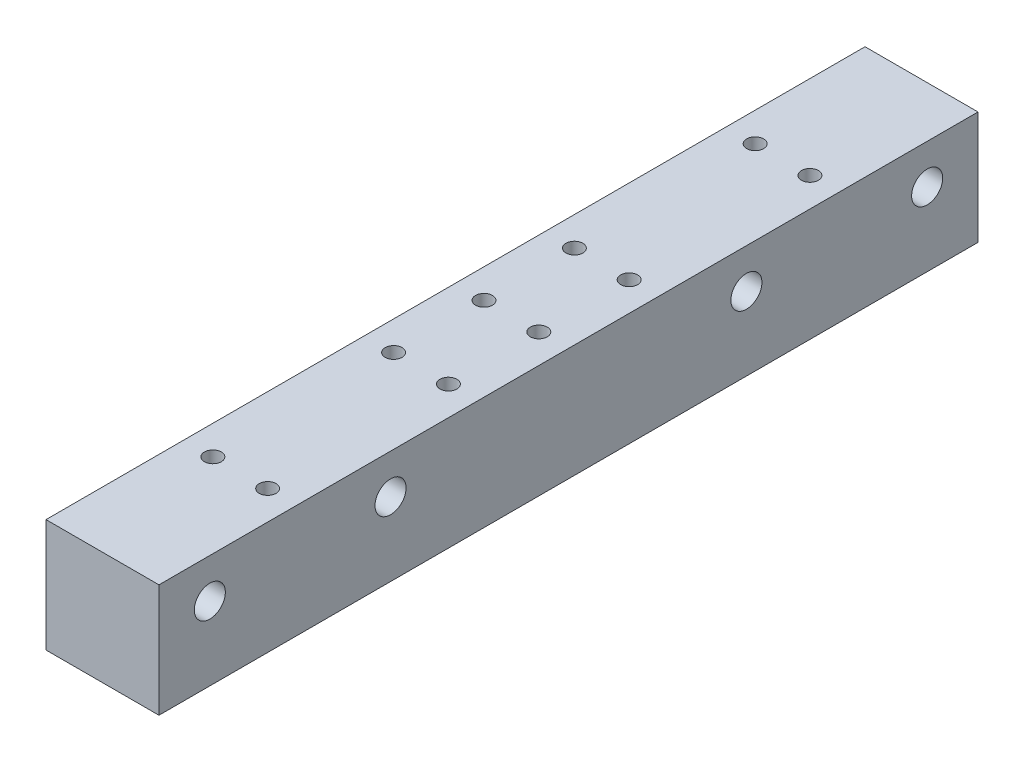
ISO-10303-21;
HEADER;
FILE_DESCRIPTION(('STEP AP214'),'2;1');
FILE_NAME('part.step','',(''),(''),'','','');
FILE_SCHEMA(('AUTOMOTIVE_DESIGN { 1 0 10303 214 1 1 1 1 }'));
ENDSEC;
DATA;
#1=APPLICATION_CONTEXT('core data for automotive mechanical design processes');
#2=APPLICATION_PROTOCOL_DEFINITION('international standard','automotive_design',2000,#1);
#3=PRODUCT_CONTEXT('',#1,'mechanical');
#4=PRODUCT('Part','Part','',(#3));
#5=PRODUCT_RELATED_PRODUCT_CATEGORY('part','',(#4));
#6=PRODUCT_DEFINITION_FORMATION('','',#4);
#7=PRODUCT_DEFINITION_CONTEXT('part definition',#1,'design');
#8=PRODUCT_DEFINITION('design','',#6,#7);
#9=PRODUCT_DEFINITION_SHAPE('','',#8);
#10=(LENGTH_UNIT() NAMED_UNIT(*) SI_UNIT(.MILLI.,.METRE.));
#11=(NAMED_UNIT(*) PLANE_ANGLE_UNIT() SI_UNIT($,.RADIAN.));
#12=(NAMED_UNIT(*) SI_UNIT($,.STERADIAN.) SOLID_ANGLE_UNIT());
#13=UNCERTAINTY_MEASURE_WITH_UNIT(LENGTH_MEASURE(1.E-05),#10,'distance_accuracy_value','');
#14=(GEOMETRIC_REPRESENTATION_CONTEXT(3) GLOBAL_UNCERTAINTY_ASSIGNED_CONTEXT((#13)) GLOBAL_UNIT_ASSIGNED_CONTEXT((#10,
#11,#12)) REPRESENTATION_CONTEXT('',''));
#15=CARTESIAN_POINT('',(0.,0.,0.));
#16=DIRECTION('',(0.,0.,1.));
#17=DIRECTION('',(1.,0.,0.));
#18=AXIS2_PLACEMENT_3D('',#15,#16,#17);
#19=CARTESIAN_POINT('',(10.,-10.,145.));
#20=DIRECTION('',(-1.,0.,0.));
#21=DIRECTION('',(0.,0.,1.));
#22=AXIS2_PLACEMENT_3D('',#19,#20,#21);
#23=PLANE('',#22);
#24=CARTESIAN_POINT('',(10.,3.,136.));
#25=DIRECTION('',(1.,0.,0.));
#26=DIRECTION('',(0.,0.,-1.));
#27=AXIS2_PLACEMENT_3D('',#24,#25,#26);
#28=CIRCLE('',#27,2.75000000000001);
#29=CARTESIAN_POINT('',(10.,3.,133.25));
#30=VERTEX_POINT('',#29);
#31=EDGE_CURVE('E129',#30,#30,#28,.T.);
#32=ORIENTED_EDGE('',*,*,#31,.F.);
#33=EDGE_LOOP('',(#32));
#34=FACE_BOUND('',#33,.T.);
#35=CARTESIAN_POINT('',(10.,3.,41.));
#36=DIRECTION('',(1.,0.,0.));
#37=DIRECTION('',(0.,0.,1.));
#38=AXIS2_PLACEMENT_3D('',#35,#36,#37);
#39=CIRCLE('',#38,2.75000000000001);
#40=CARTESIAN_POINT('',(10.,3.,38.25));
#41=VERTEX_POINT('',#40);
#42=EDGE_CURVE('E125',#41,#41,#39,.T.);
#43=ORIENTED_EDGE('',*,*,#42,.F.);
#44=EDGE_LOOP('',(#43));
#45=FACE_BOUND('',#44,.T.);
#46=CARTESIAN_POINT('',(10.,3.,9.00000000000001));
#47=DIRECTION('',(1.,0.,0.));
#48=DIRECTION('',(0.,0.,1.));
#49=AXIS2_PLACEMENT_3D('',#46,#47,#48);
#50=CIRCLE('',#49,2.75000000000001);
#51=CARTESIAN_POINT('',(10.,3.,6.25));
#52=VERTEX_POINT('',#51);
#53=EDGE_CURVE('E118',#52,#52,#50,.T.);
#54=ORIENTED_EDGE('',*,*,#53,.F.);
#55=EDGE_LOOP('',(#54));
#56=FACE_BOUND('',#55,.T.);
#57=CARTESIAN_POINT('',(10.,3.,104.));
#58=DIRECTION('',(1.,0.,0.));
#59=DIRECTION('',(0.,0.,-1.));
#60=AXIS2_PLACEMENT_3D('',#57,#58,#59);
#61=CIRCLE('',#60,2.75000000000001);
#62=CARTESIAN_POINT('',(10.,3.,101.25));
#63=VERTEX_POINT('',#62);
#64=EDGE_CURVE('E126',#63,#63,#61,.T.);
#65=ORIENTED_EDGE('',*,*,#64,.F.);
#66=EDGE_LOOP('',(#65));
#67=FACE_BOUND('',#66,.T.);
#68=DIRECTION('',(0.,1.,0.));
#69=VECTOR('',#68,1.);
#70=CARTESIAN_POINT('',(10.,-10.,0.));
#71=LINE('',#70,#69);
#72=CARTESIAN_POINT('',(10.,-10.,0.));
#73=VERTEX_POINT('',#72);
#74=CARTESIAN_POINT('',(10.,10.,0.));
#75=VERTEX_POINT('',#74);
#76=EDGE_CURVE('E104',#73,#75,#71,.T.);
#77=ORIENTED_EDGE('',*,*,#76,.T.);
#78=DIRECTION('',(0.,0.,-1.));
#79=VECTOR('',#78,1.);
#80=CARTESIAN_POINT('',(10.,10.,145.));
#81=LINE('',#80,#79);
#82=CARTESIAN_POINT('',(10.,10.,145.));
#83=VERTEX_POINT('',#82);
#84=EDGE_CURVE('E11',#83,#75,#81,.T.);
#85=ORIENTED_EDGE('',*,*,#84,.F.);
#86=DIRECTION('',(0.,1.,0.));
#87=VECTOR('',#86,1.);
#88=CARTESIAN_POINT('',(10.,-10.,145.));
#89=LINE('',#88,#87);
#90=CARTESIAN_POINT('',(10.,-10.,145.));
#91=VERTEX_POINT('',#90);
#92=EDGE_CURVE('E92',#91,#83,#89,.T.);
#93=ORIENTED_EDGE('',*,*,#92,.F.);
#94=DIRECTION('',(0.,0.,-1.));
#95=VECTOR('',#94,1.);
#96=CARTESIAN_POINT('',(10.,-10.,145.));
#97=LINE('',#96,#95);
#98=EDGE_CURVE('E100',#91,#73,#97,.T.);
#99=ORIENTED_EDGE('',*,*,#98,.T.);
#100=EDGE_LOOP('',(#77,#85,#93,#99));
#101=FACE_BOUND('',#100,.T.);
#102=ADVANCED_FACE('F41',(#34,#45,#56,#67,#101),#23,.F.);
#103=CARTESIAN_POINT('',(-10.,10.,145.));
#104=DIRECTION('',(0.,-1.,0.));
#105=DIRECTION('',(0.,0.,-1.));
#106=AXIS2_PLACEMENT_3D('',#103,#104,#105);
#107=PLANE('',#106);
#108=CARTESIAN_POINT('',(4.85000000000753,10.,24.6069730418757));
#109=DIRECTION('',(0.,1.,0.));
#110=DIRECTION('',(0.,0.,-1.));
#111=AXIS2_PLACEMENT_3D('',#108,#109,#110);
#112=CIRCLE('',#111,1.5);
#113=CARTESIAN_POINT('',(4.85000000000753,10.,23.1069730418757));
#114=VERTEX_POINT('',#113);
#115=EDGE_CURVE('E148',#114,#114,#112,.T.);
#116=ORIENTED_EDGE('',*,*,#115,.F.);
#117=EDGE_LOOP('',(#116));
#118=FACE_BOUND('',#117,.T.);
#119=CARTESIAN_POINT('',(4.85000000000753,10.,56.6069730418757));
#120=DIRECTION('',(0.,1.,0.));
#121=DIRECTION('',(0.,0.,-1.));
#122=AXIS2_PLACEMENT_3D('',#119,#120,#121);
#123=CIRCLE('',#122,1.5);
#124=CARTESIAN_POINT('',(4.85000000000753,10.,55.1069730418757));
#125=VERTEX_POINT('',#124);
#126=EDGE_CURVE('E155',#125,#125,#123,.T.);
#127=ORIENTED_EDGE('',*,*,#126,.F.);
#128=EDGE_LOOP('',(#127));
#129=FACE_BOUND('',#128,.T.);
#130=CARTESIAN_POINT('',(4.85000000000753,10.,72.6069730418757));
#131=DIRECTION('',(0.,1.,0.));
#132=DIRECTION('',(0.,0.,-1.));
#133=AXIS2_PLACEMENT_3D('',#130,#131,#132);
#134=CIRCLE('',#133,1.5);
#135=CARTESIAN_POINT('',(4.85000000000753,10.,71.1069730418757));
#136=VERTEX_POINT('',#135);
#137=EDGE_CURVE('E161',#136,#136,#134,.T.);
#138=ORIENTED_EDGE('',*,*,#137,.F.);
#139=EDGE_LOOP('',(#138));
#140=FACE_BOUND('',#139,.T.);
#141=CARTESIAN_POINT('',(4.85000000000754,10.,88.6069730418757));
#142=DIRECTION('',(0.,1.,0.));
#143=DIRECTION('',(0.,0.,-1.));
#144=AXIS2_PLACEMENT_3D('',#141,#142,#143);
#145=CIRCLE('',#144,1.5);
#146=CARTESIAN_POINT('',(4.85000000000754,10.,87.1069730418757));
#147=VERTEX_POINT('',#146);
#148=EDGE_CURVE('E167',#147,#147,#145,.T.);
#149=ORIENTED_EDGE('',*,*,#148,.F.);
#150=EDGE_LOOP('',(#149));
#151=FACE_BOUND('',#150,.T.);
#152=CARTESIAN_POINT('',(4.85000000000753,10.,120.606973041876));
#153=DIRECTION('',(0.,1.,0.));
#154=DIRECTION('',(0.,0.,-1.));
#155=AXIS2_PLACEMENT_3D('',#152,#153,#154);
#156=CIRCLE('',#155,1.5);
#157=CARTESIAN_POINT('',(4.85000000000753,10.,119.106973041876));
#158=VERTEX_POINT('',#157);
#159=EDGE_CURVE('E173',#158,#158,#156,.T.);
#160=ORIENTED_EDGE('',*,*,#159,.F.);
#161=EDGE_LOOP('',(#160));
#162=FACE_BOUND('',#161,.T.);
#163=CARTESIAN_POINT('',(-4.8500000000075,10.,120.606973041876));
#164=DIRECTION('',(0.,1.,0.));
#165=DIRECTION('',(0.,0.,1.));
#166=AXIS2_PLACEMENT_3D('',#163,#164,#165);
#167=CIRCLE('',#166,1.5);
#168=CARTESIAN_POINT('',(-4.8500000000075,10.,122.106973041876));
#169=VERTEX_POINT('',#168);
#170=EDGE_CURVE('E179',#169,#169,#167,.T.);
#171=ORIENTED_EDGE('',*,*,#170,.F.);
#172=EDGE_LOOP('',(#171));
#173=FACE_BOUND('',#172,.T.);
#174=CARTESIAN_POINT('',(-4.85000000000752,10.,88.6069730418757));
#175=DIRECTION('',(0.,1.,0.));
#176=DIRECTION('',(0.,0.,1.));
#177=AXIS2_PLACEMENT_3D('',#174,#175,#176);
#178=CIRCLE('',#177,1.5);
#179=CARTESIAN_POINT('',(-4.85000000000752,10.,90.1069730418757));
#180=VERTEX_POINT('',#179);
#181=EDGE_CURVE('E185',#180,#180,#178,.T.);
#182=ORIENTED_EDGE('',*,*,#181,.F.);
#183=EDGE_LOOP('',(#182));
#184=FACE_BOUND('',#183,.T.);
#185=CARTESIAN_POINT('',(-4.85000000000752,10.,72.6069730418757));
#186=DIRECTION('',(0.,1.,0.));
#187=DIRECTION('',(0.,0.,1.));
#188=AXIS2_PLACEMENT_3D('',#185,#186,#187);
#189=CIRCLE('',#188,1.5);
#190=CARTESIAN_POINT('',(-4.85000000000752,10.,74.1069730418757));
#191=VERTEX_POINT('',#190);
#192=EDGE_CURVE('E191',#191,#191,#189,.T.);
#193=ORIENTED_EDGE('',*,*,#192,.F.);
#194=EDGE_LOOP('',(#193));
#195=FACE_BOUND('',#194,.T.);
#196=CARTESIAN_POINT('',(-4.85000000000752,10.,56.6069730418757));
#197=DIRECTION('',(0.,1.,0.));
#198=DIRECTION('',(0.,0.,1.));
#199=AXIS2_PLACEMENT_3D('',#196,#197,#198);
#200=CIRCLE('',#199,1.5);
#201=CARTESIAN_POINT('',(-4.85000000000752,10.,58.1069730418757));
#202=VERTEX_POINT('',#201);
#203=EDGE_CURVE('E147',#202,#202,#200,.T.);
#204=ORIENTED_EDGE('',*,*,#203,.F.);
#205=EDGE_LOOP('',(#204));
#206=FACE_BOUND('',#205,.T.);
#207=CARTESIAN_POINT('',(-4.85000000000753,10.,24.6069730418757));
#208=DIRECTION('',(0.,1.,0.));
#209=DIRECTION('',(0.,0.,1.));
#210=AXIS2_PLACEMENT_3D('',#207,#208,#209);
#211=CIRCLE('',#210,1.5);
#212=CARTESIAN_POINT('',(-4.85000000000753,10.,26.1069730418757));
#213=VERTEX_POINT('',#212);
#214=EDGE_CURVE('E144',#213,#213,#211,.T.);
#215=ORIENTED_EDGE('',*,*,#214,.F.);
#216=EDGE_LOOP('',(#215));
#217=FACE_BOUND('',#216,.T.);
#218=DIRECTION('',(-1.,0.,0.));
#219=VECTOR('',#218,1.);
#220=CARTESIAN_POINT('',(-10.,10.,0.));
#221=LINE('',#220,#219);
#222=CARTESIAN_POINT('',(-10.,10.,0.));
#223=VERTEX_POINT('',#222);
#224=EDGE_CURVE('E96',#75,#223,#221,.T.);
#225=ORIENTED_EDGE('',*,*,#224,.T.);
#226=DIRECTION('',(0.,0.,-1.));
#227=VECTOR('',#226,1.);
#228=CARTESIAN_POINT('',(-10.,10.,145.));
#229=LINE('',#228,#227);
#230=CARTESIAN_POINT('',(-10.,10.,145.));
#231=VERTEX_POINT('',#230);
#232=EDGE_CURVE('E49',#231,#223,#229,.T.);
#233=ORIENTED_EDGE('',*,*,#232,.F.);
#234=DIRECTION('',(-1.,0.,0.));
#235=VECTOR('',#234,1.);
#236=CARTESIAN_POINT('',(-10.,10.,145.));
#237=LINE('',#236,#235);
#238=EDGE_CURVE('E87',#83,#231,#237,.T.);
#239=ORIENTED_EDGE('',*,*,#238,.F.);
#240=ORIENTED_EDGE('',*,*,#84,.T.);
#241=EDGE_LOOP('',(#225,#233,#239,#240));
#242=FACE_BOUND('',#241,.T.);
#243=ADVANCED_FACE('F95',(#118,#129,#140,#151,#162,#173,#184,#195,#206,#217,#242),#107,.F.);
#244=CARTESIAN_POINT('',(-10.,-10.,145.));
#245=DIRECTION('',(1.,0.,0.));
#246=DIRECTION('',(0.,0.,-1.));
#247=AXIS2_PLACEMENT_3D('',#244,#245,#246);
#248=PLANE('',#247);
#249=CARTESIAN_POINT('',(-10.,3.,136.));
#250=DIRECTION('',(1.,0.,0.));
#251=DIRECTION('',(0.,0.,-1.));
#252=AXIS2_PLACEMENT_3D('',#249,#250,#251);
#253=CIRCLE('',#252,2.75000000000001);
#254=CARTESIAN_POINT('',(-10.,3.,133.25));
#255=VERTEX_POINT('',#254);
#256=EDGE_CURVE('E107',#255,#255,#253,.F.);
#257=ORIENTED_EDGE('',*,*,#256,.F.);
#258=EDGE_LOOP('',(#257));
#259=FACE_BOUND('',#258,.T.);
#260=CARTESIAN_POINT('',(-10.,3.,41.));
#261=DIRECTION('',(1.,0.,0.));
#262=DIRECTION('',(0.,0.,-1.));
#263=AXIS2_PLACEMENT_3D('',#260,#261,#262);
#264=CIRCLE('',#263,2.75000000000001);
#265=CARTESIAN_POINT('',(-10.,3.,38.25));
#266=VERTEX_POINT('',#265);
#267=EDGE_CURVE('E134',#266,#266,#264,.F.);
#268=ORIENTED_EDGE('',*,*,#267,.F.);
#269=EDGE_LOOP('',(#268));
#270=FACE_BOUND('',#269,.T.);
#271=CARTESIAN_POINT('',(-10.,3.,9.00000000000001));
#272=DIRECTION('',(1.,0.,0.));
#273=DIRECTION('',(0.,0.,-1.));
#274=AXIS2_PLACEMENT_3D('',#271,#272,#273);
#275=CIRCLE('',#274,2.75000000000001);
#276=CARTESIAN_POINT('',(-10.,3.,6.25));
#277=VERTEX_POINT('',#276);
#278=EDGE_CURVE('E122',#277,#277,#275,.F.);
#279=ORIENTED_EDGE('',*,*,#278,.F.);
#280=EDGE_LOOP('',(#279));
#281=FACE_BOUND('',#280,.T.);
#282=CARTESIAN_POINT('',(-10.,3.,104.));
#283=DIRECTION('',(1.,0.,0.));
#284=DIRECTION('',(0.,0.,-1.));
#285=AXIS2_PLACEMENT_3D('',#282,#283,#284);
#286=CIRCLE('',#285,2.75000000000001);
#287=CARTESIAN_POINT('',(-10.,3.,101.25));
#288=VERTEX_POINT('',#287);
#289=EDGE_CURVE('E121',#288,#288,#286,.F.);
#290=ORIENTED_EDGE('',*,*,#289,.F.);
#291=EDGE_LOOP('',(#290));
#292=FACE_BOUND('',#291,.T.);
#293=DIRECTION('',(0.,-1.,0.));
#294=VECTOR('',#293,1.);
#295=CARTESIAN_POINT('',(-10.,-10.,0.));
#296=LINE('',#295,#294);
#297=CARTESIAN_POINT('',(-10.,-10.,0.));
#298=VERTEX_POINT('',#297);
#299=EDGE_CURVE('E74',#223,#298,#296,.T.);
#300=ORIENTED_EDGE('',*,*,#299,.T.);
#301=DIRECTION('',(0.,0.,-1.));
#302=VECTOR('',#301,1.);
#303=CARTESIAN_POINT('',(-10.,-10.,145.));
#304=LINE('',#303,#302);
#305=CARTESIAN_POINT('',(-10.,-10.,145.));
#306=VERTEX_POINT('',#305);
#307=EDGE_CURVE('E97',#306,#298,#304,.T.);
#308=ORIENTED_EDGE('',*,*,#307,.F.);
#309=DIRECTION('',(0.,-1.,0.));
#310=VECTOR('',#309,1.);
#311=CARTESIAN_POINT('',(-10.,-10.,145.));
#312=LINE('',#311,#310);
#313=EDGE_CURVE('E90',#231,#306,#312,.T.);
#314=ORIENTED_EDGE('',*,*,#313,.F.);
#315=ORIENTED_EDGE('',*,*,#232,.T.);
#316=EDGE_LOOP('',(#300,#308,#314,#315));
#317=FACE_BOUND('',#316,.T.);
#318=ADVANCED_FACE('F98',(#259,#270,#281,#292,#317),#248,.F.);
#319=CARTESIAN_POINT('',(-10.,-10.,145.));
#320=DIRECTION('',(0.,1.,0.));
#321=DIRECTION('',(0.,0.,1.));
#322=AXIS2_PLACEMENT_3D('',#319,#320,#321);
#323=PLANE('',#322);
#324=CARTESIAN_POINT('',(4.85000000000753,-10.,24.6069730418757));
#325=DIRECTION('',(0.,1.,0.));
#326=DIRECTION('',(0.,0.,1.));
#327=AXIS2_PLACEMENT_3D('',#324,#325,#326);
#328=CIRCLE('',#327,1.5);
#329=CARTESIAN_POINT('',(4.85000000000753,-10.,26.1069730418757));
#330=VERTEX_POINT('',#329);
#331=EDGE_CURVE('E152',#330,#330,#328,.F.);
#332=ORIENTED_EDGE('',*,*,#331,.F.);
#333=EDGE_LOOP('',(#332));
#334=FACE_BOUND('',#333,.T.);
#335=CARTESIAN_POINT('',(4.85000000000753,-10.,56.6069730418757));
#336=DIRECTION('',(0.,1.,0.));
#337=DIRECTION('',(0.,0.,1.));
#338=AXIS2_PLACEMENT_3D('',#335,#336,#337);
#339=CIRCLE('',#338,1.5);
#340=CARTESIAN_POINT('',(4.85000000000753,-10.,58.1069730418757));
#341=VERTEX_POINT('',#340);
#342=EDGE_CURVE('E151',#341,#341,#339,.F.);
#343=ORIENTED_EDGE('',*,*,#342,.F.);
#344=EDGE_LOOP('',(#343));
#345=FACE_BOUND('',#344,.T.);
#346=CARTESIAN_POINT('',(4.85000000000753,-10.,72.6069730418757));
#347=DIRECTION('',(0.,1.,0.));
#348=DIRECTION('',(0.,0.,1.));
#349=AXIS2_PLACEMENT_3D('',#346,#347,#348);
#350=CIRCLE('',#349,1.5);
#351=CARTESIAN_POINT('',(4.85000000000753,-10.,74.1069730418757));
#352=VERTEX_POINT('',#351);
#353=EDGE_CURVE('E158',#352,#352,#350,.F.);
#354=ORIENTED_EDGE('',*,*,#353,.F.);
#355=EDGE_LOOP('',(#354));
#356=FACE_BOUND('',#355,.T.);
#357=CARTESIAN_POINT('',(4.85000000000754,-10.,88.6069730418757));
#358=DIRECTION('',(0.,1.,0.));
#359=DIRECTION('',(0.,0.,1.));
#360=AXIS2_PLACEMENT_3D('',#357,#358,#359);
#361=CIRCLE('',#360,1.5);
#362=CARTESIAN_POINT('',(4.85000000000754,-10.,90.1069730418757));
#363=VERTEX_POINT('',#362);
#364=EDGE_CURVE('E164',#363,#363,#361,.F.);
#365=ORIENTED_EDGE('',*,*,#364,.F.);
#366=EDGE_LOOP('',(#365));
#367=FACE_BOUND('',#366,.T.);
#368=CARTESIAN_POINT('',(4.85000000000753,-10.,120.606973041876));
#369=DIRECTION('',(0.,1.,0.));
#370=DIRECTION('',(0.,0.,1.));
#371=AXIS2_PLACEMENT_3D('',#368,#369,#370);
#372=CIRCLE('',#371,1.5);
#373=CARTESIAN_POINT('',(4.85000000000753,-10.,122.106973041876));
#374=VERTEX_POINT('',#373);
#375=EDGE_CURVE('E170',#374,#374,#372,.F.);
#376=ORIENTED_EDGE('',*,*,#375,.F.);
#377=EDGE_LOOP('',(#376));
#378=FACE_BOUND('',#377,.T.);
#379=CARTESIAN_POINT('',(-4.8500000000075,-10.,120.606973041876));
#380=DIRECTION('',(0.,1.,0.));
#381=DIRECTION('',(0.,0.,1.));
#382=AXIS2_PLACEMENT_3D('',#379,#380,#381);
#383=CIRCLE('',#382,1.5);
#384=CARTESIAN_POINT('',(-4.8500000000075,-10.,122.106973041876));
#385=VERTEX_POINT('',#384);
#386=EDGE_CURVE('E176',#385,#385,#383,.F.);
#387=ORIENTED_EDGE('',*,*,#386,.F.);
#388=EDGE_LOOP('',(#387));
#389=FACE_BOUND('',#388,.T.);
#390=CARTESIAN_POINT('',(-4.85000000000752,-10.,88.6069730418757));
#391=DIRECTION('',(0.,1.,0.));
#392=DIRECTION('',(0.,0.,1.));
#393=AXIS2_PLACEMENT_3D('',#390,#391,#392);
#394=CIRCLE('',#393,1.5);
#395=CARTESIAN_POINT('',(-4.85000000000752,-10.,90.1069730418757));
#396=VERTEX_POINT('',#395);
#397=EDGE_CURVE('E182',#396,#396,#394,.F.);
#398=ORIENTED_EDGE('',*,*,#397,.F.);
#399=EDGE_LOOP('',(#398));
#400=FACE_BOUND('',#399,.T.);
#401=CARTESIAN_POINT('',(-4.85000000000752,-10.,72.6069730418757));
#402=DIRECTION('',(0.,1.,0.));
#403=DIRECTION('',(0.,0.,1.));
#404=AXIS2_PLACEMENT_3D('',#401,#402,#403);
#405=CIRCLE('',#404,1.5);
#406=CARTESIAN_POINT('',(-4.85000000000752,-10.,74.1069730418757));
#407=VERTEX_POINT('',#406);
#408=EDGE_CURVE('E188',#407,#407,#405,.F.);
#409=ORIENTED_EDGE('',*,*,#408,.F.);
#410=EDGE_LOOP('',(#409));
#411=FACE_BOUND('',#410,.T.);
#412=CARTESIAN_POINT('',(-4.85000000000752,-10.,56.6069730418757));
#413=DIRECTION('',(0.,1.,0.));
#414=DIRECTION('',(0.,0.,1.));
#415=AXIS2_PLACEMENT_3D('',#412,#413,#414);
#416=CIRCLE('',#415,1.5);
#417=CARTESIAN_POINT('',(-4.85000000000752,-10.,58.1069730418757));
#418=VERTEX_POINT('',#417);
#419=EDGE_CURVE('E194',#418,#418,#416,.F.);
#420=ORIENTED_EDGE('',*,*,#419,.F.);
#421=EDGE_LOOP('',(#420));
#422=FACE_BOUND('',#421,.T.);
#423=CARTESIAN_POINT('',(-4.85000000000753,-10.,24.6069730418757));
#424=DIRECTION('',(0.,1.,0.));
#425=DIRECTION('',(0.,0.,1.));
#426=AXIS2_PLACEMENT_3D('',#423,#424,#425);
#427=CIRCLE('',#426,1.5);
#428=CARTESIAN_POINT('',(-4.85000000000753,-10.,26.1069730418757));
#429=VERTEX_POINT('',#428);
#430=EDGE_CURVE('E137',#429,#429,#427,.F.);
#431=ORIENTED_EDGE('',*,*,#430,.F.);
#432=EDGE_LOOP('',(#431));
#433=FACE_BOUND('',#432,.T.);
#434=DIRECTION('',(1.,0.,0.));
#435=VECTOR('',#434,1.);
#436=CARTESIAN_POINT('',(-10.,-10.,0.));
#437=LINE('',#436,#435);
#438=EDGE_CURVE('E80',#298,#73,#437,.T.);
#439=ORIENTED_EDGE('',*,*,#438,.T.);
#440=ORIENTED_EDGE('',*,*,#98,.F.);
#441=DIRECTION('',(1.,0.,0.));
#442=VECTOR('',#441,1.);
#443=CARTESIAN_POINT('',(-10.,-10.,145.));
#444=LINE('',#443,#442);
#445=EDGE_CURVE('E57',#306,#91,#444,.T.);
#446=ORIENTED_EDGE('',*,*,#445,.F.);
#447=ORIENTED_EDGE('',*,*,#307,.T.);
#448=EDGE_LOOP('',(#439,#440,#446,#447));
#449=FACE_BOUND('',#448,.T.);
#450=ADVANCED_FACE('F112',(#334,#345,#356,#367,#378,#389,#400,#411,#422,#433,#449),#323,.F.);
#451=CARTESIAN_POINT('',(0.,0.,145.));
#452=DIRECTION('',(0.,0.,-1.));
#453=DIRECTION('',(-1.,0.,0.));
#454=AXIS2_PLACEMENT_3D('',#451,#452,#453);
#455=PLANE('',#454);
#456=ORIENTED_EDGE('',*,*,#92,.T.);
#457=ORIENTED_EDGE('',*,*,#238,.T.);
#458=ORIENTED_EDGE('',*,*,#313,.T.);
#459=ORIENTED_EDGE('',*,*,#445,.T.);
#460=EDGE_LOOP('',(#456,#457,#458,#459));
#461=FACE_BOUND('',#460,.T.);
#462=ADVANCED_FACE('F88',(#461),#455,.F.);
#463=CARTESIAN_POINT('',(0.,0.,0.));
#464=DIRECTION('',(0.,0.,-1.));
#465=DIRECTION('',(-1.,0.,0.));
#466=AXIS2_PLACEMENT_3D('',#463,#464,#465);
#467=PLANE('',#466);
#468=ORIENTED_EDGE('',*,*,#76,.F.);
#469=ORIENTED_EDGE('',*,*,#438,.F.);
#470=ORIENTED_EDGE('',*,*,#299,.F.);
#471=ORIENTED_EDGE('',*,*,#224,.F.);
#472=EDGE_LOOP('',(#468,#469,#470,#471));
#473=FACE_BOUND('',#472,.T.);
#474=ADVANCED_FACE('F115',(#473),#467,.T.);
#475=CARTESIAN_POINT('',(-17.7781745930521,3.,104.));
#476=DIRECTION('',(1.,0.,0.));
#477=DIRECTION('',(0.,0.,-1.));
#478=AXIS2_PLACEMENT_3D('',#475,#476,#477);
#479=CYLINDRICAL_SURFACE('',#478,2.75000000000001);
#480=CARTESIAN_POINT('',(-10.,3.,101.25));
#481=CARTESIAN_POINT('',(-9.79166666666667,3.,101.25));
#482=CARTESIAN_POINT('',(-9.58333333333333,3.,101.25));
#483=CARTESIAN_POINT('',(-9.16666666666667,3.,101.25));
#484=CARTESIAN_POINT('',(-8.95833333333333,3.,101.25));
#485=CARTESIAN_POINT('',(-8.54166666666667,3.,101.25));
#486=CARTESIAN_POINT('',(-8.33333333333333,3.,101.25));
#487=CARTESIAN_POINT('',(-7.91666666666667,3.,101.25));
#488=CARTESIAN_POINT('',(-7.70833333333333,3.,101.25));
#489=CARTESIAN_POINT('',(-7.29166666666667,3.,101.25));
#490=CARTESIAN_POINT('',(-7.08333333333333,3.,101.25));
#491=CARTESIAN_POINT('',(-6.66666666666667,3.,101.25));
#492=CARTESIAN_POINT('',(-6.45833333333333,3.,101.25));
#493=CARTESIAN_POINT('',(-6.04166666666667,3.,101.25));
#494=CARTESIAN_POINT('',(-5.83333333333333,3.,101.25));
#495=CARTESIAN_POINT('',(-5.41666666666667,3.,101.25));
#496=CARTESIAN_POINT('',(-5.20833333333333,3.,101.25));
#497=CARTESIAN_POINT('',(-4.79166666666667,3.,101.25));
#498=CARTESIAN_POINT('',(-4.58333333333333,3.,101.25));
#499=CARTESIAN_POINT('',(-4.16666666666667,3.,101.25));
#500=CARTESIAN_POINT('',(-3.95833333333333,3.,101.25));
#501=CARTESIAN_POINT('',(-3.54166666666667,3.,101.25));
#502=CARTESIAN_POINT('',(-3.33333333333333,3.,101.25));
#503=CARTESIAN_POINT('',(-2.91666666666667,3.,101.25));
#504=CARTESIAN_POINT('',(-2.70833333333333,3.,101.25));
#505=CARTESIAN_POINT('',(-2.29166666666667,3.,101.25));
#506=CARTESIAN_POINT('',(-2.08333333333333,3.,101.25));
#507=CARTESIAN_POINT('',(-1.66666666666667,3.,101.25));
#508=CARTESIAN_POINT('',(-1.45833333333333,3.,101.25));
#509=CARTESIAN_POINT('',(-1.04166666666667,3.,101.25));
#510=CARTESIAN_POINT('',(-0.833333333333334,3.,101.25));
#511=CARTESIAN_POINT('',(-0.416666666666667,3.,101.25));
#512=CARTESIAN_POINT('',(-0.208333333333333,3.,101.25));
#513=CARTESIAN_POINT('',(0.208333333333333,3.,101.25));
#514=CARTESIAN_POINT('',(0.416666666666667,3.,101.25));
#515=CARTESIAN_POINT('',(0.833333333333334,3.,101.25));
#516=CARTESIAN_POINT('',(1.04166666666667,3.,101.25));
#517=CARTESIAN_POINT('',(1.45833333333333,3.,101.25));
#518=CARTESIAN_POINT('',(1.66666666666667,3.,101.25));
#519=CARTESIAN_POINT('',(2.08333333333334,3.,101.25));
#520=CARTESIAN_POINT('',(2.29166666666667,3.,101.25));
#521=CARTESIAN_POINT('',(2.70833333333334,3.,101.25));
#522=CARTESIAN_POINT('',(2.91666666666667,3.,101.25));
#523=CARTESIAN_POINT('',(3.33333333333334,3.,101.25));
#524=CARTESIAN_POINT('',(3.54166666666667,3.,101.25));
#525=CARTESIAN_POINT('',(3.95833333333333,3.,101.25));
#526=CARTESIAN_POINT('',(4.16666666666667,3.,101.25));
#527=CARTESIAN_POINT('',(4.58333333333333,3.,101.25));
#528=CARTESIAN_POINT('',(4.79166666666667,3.,101.25));
#529=CARTESIAN_POINT('',(5.20833333333333,3.,101.25));
#530=CARTESIAN_POINT('',(5.41666666666667,3.,101.25));
#531=CARTESIAN_POINT('',(5.83333333333334,3.,101.25));
#532=CARTESIAN_POINT('',(6.04166666666667,3.,101.25));
#533=CARTESIAN_POINT('',(6.45833333333334,3.,101.25));
#534=CARTESIAN_POINT('',(6.66666666666667,3.,101.25));
#535=CARTESIAN_POINT('',(7.08333333333333,3.,101.25));
#536=CARTESIAN_POINT('',(7.29166666666667,3.,101.25));
#537=CARTESIAN_POINT('',(7.70833333333333,3.,101.25));
#538=CARTESIAN_POINT('',(7.91666666666667,3.,101.25));
#539=CARTESIAN_POINT('',(8.33333333333333,3.,101.25));
#540=CARTESIAN_POINT('',(8.54166666666667,3.,101.25));
#541=CARTESIAN_POINT('',(8.95833333333333,3.,101.25));
#542=CARTESIAN_POINT('',(9.16666666666667,3.,101.25));
#543=CARTESIAN_POINT('',(9.58333333333333,3.,101.25));
#544=CARTESIAN_POINT('',(9.79166666666667,3.,101.25));
#545=CARTESIAN_POINT('',(10.,3.,101.25));
#546=B_SPLINE_CURVE_WITH_KNOTS('',3,(#480,#481,#482,#483,#484,#485,#486,#487,#488,#489,#490,
#491,#492,#493,#494,#495,#496,#497,#498,#499,#500,#501,#502,#503,#504,#505,#506,#507,#508,#509,
#510,#511,#512,#513,#514,#515,#516,#517,#518,#519,#520,#521,#522,#523,#524,#525,#526,#527,#528,
#529,#530,#531,#532,#533,#534,#535,#536,#537,#538,#539,#540,#541,#542,#543,#544,#545),
.UNSPECIFIED.,.F.,.F.,(4,2,2,2,2,2,2,2,2,2,2,2,2,2,2,2,2,2,2,2,2,2,2,2,2,2,2,2,2,2,2,2,4),(0.,
0.624999999999999,1.25,1.875,2.5,3.125,3.75,4.375,5.,5.625,6.25,6.875,7.5,8.125,8.75,9.375,10.,
10.625,11.25,11.875,12.5,13.125,13.75,14.375,15.,15.625,16.25,16.875,17.5,18.125,18.75,19.375,
20.),.UNSPECIFIED.);
#547=EDGE_CURVE('BSEAM233',#288,#63,#546,.T.);
#548=ORIENTED_EDGE('',*,*,#289,.T.);
#549=ORIENTED_EDGE('',*,*,#64,.T.);
#550=ORIENTED_EDGE('',*,*,#547,.T.);
#551=ORIENTED_EDGE('',*,*,#547,.F.);
#552=EDGE_LOOP('',(#548,#550,#549,#551));
#553=FACE_BOUND('',#552,.T.);
#554=ADVANCED_FACE('F233',(#553),#479,.F.);
#555=CARTESIAN_POINT('',(-17.7781745930521,3.,9.00000000000001));
#556=DIRECTION('',(1.,0.,0.));
#557=DIRECTION('',(0.,0.,-1.));
#558=AXIS2_PLACEMENT_3D('',#555,#556,#557);
#559=CYLINDRICAL_SURFACE('',#558,2.75000000000001);
#560=CARTESIAN_POINT('',(-10.,3.,6.25));
#561=CARTESIAN_POINT('',(-9.79166666666667,3.,6.25));
#562=CARTESIAN_POINT('',(-9.58333333333333,3.,6.25));
#563=CARTESIAN_POINT('',(-9.16666666666667,3.,6.25));
#564=CARTESIAN_POINT('',(-8.95833333333333,3.,6.25));
#565=CARTESIAN_POINT('',(-8.54166666666667,3.,6.25));
#566=CARTESIAN_POINT('',(-8.33333333333333,3.,6.25));
#567=CARTESIAN_POINT('',(-7.91666666666667,3.,6.25));
#568=CARTESIAN_POINT('',(-7.70833333333333,3.,6.25));
#569=CARTESIAN_POINT('',(-7.29166666666667,3.,6.25));
#570=CARTESIAN_POINT('',(-7.08333333333333,3.,6.25));
#571=CARTESIAN_POINT('',(-6.66666666666667,3.,6.25));
#572=CARTESIAN_POINT('',(-6.45833333333333,3.,6.25));
#573=CARTESIAN_POINT('',(-6.04166666666667,3.,6.25));
#574=CARTESIAN_POINT('',(-5.83333333333333,3.,6.25));
#575=CARTESIAN_POINT('',(-5.41666666666667,3.,6.25));
#576=CARTESIAN_POINT('',(-5.20833333333333,3.,6.25));
#577=CARTESIAN_POINT('',(-4.79166666666667,3.,6.25));
#578=CARTESIAN_POINT('',(-4.58333333333333,3.,6.25));
#579=CARTESIAN_POINT('',(-4.16666666666667,3.,6.25));
#580=CARTESIAN_POINT('',(-3.95833333333333,3.,6.25));
#581=CARTESIAN_POINT('',(-3.54166666666667,3.,6.25));
#582=CARTESIAN_POINT('',(-3.33333333333333,3.,6.25));
#583=CARTESIAN_POINT('',(-2.91666666666667,3.,6.25));
#584=CARTESIAN_POINT('',(-2.70833333333333,3.,6.25));
#585=CARTESIAN_POINT('',(-2.29166666666667,3.,6.25));
#586=CARTESIAN_POINT('',(-2.08333333333333,3.,6.25));
#587=CARTESIAN_POINT('',(-1.66666666666667,3.,6.25));
#588=CARTESIAN_POINT('',(-1.45833333333333,3.,6.25));
#589=CARTESIAN_POINT('',(-1.04166666666667,3.,6.25));
#590=CARTESIAN_POINT('',(-0.833333333333334,3.,6.25));
#591=CARTESIAN_POINT('',(-0.416666666666667,3.,6.25));
#592=CARTESIAN_POINT('',(-0.208333333333333,3.,6.25));
#593=CARTESIAN_POINT('',(0.208333333333333,3.,6.25));
#594=CARTESIAN_POINT('',(0.416666666666667,3.,6.25));
#595=CARTESIAN_POINT('',(0.833333333333334,3.,6.25));
#596=CARTESIAN_POINT('',(1.04166666666667,3.,6.25));
#597=CARTESIAN_POINT('',(1.45833333333333,3.,6.25));
#598=CARTESIAN_POINT('',(1.66666666666667,3.,6.25));
#599=CARTESIAN_POINT('',(2.08333333333334,3.,6.25));
#600=CARTESIAN_POINT('',(2.29166666666667,3.,6.25));
#601=CARTESIAN_POINT('',(2.70833333333334,3.,6.25));
#602=CARTESIAN_POINT('',(2.91666666666667,3.,6.25));
#603=CARTESIAN_POINT('',(3.33333333333334,3.,6.25));
#604=CARTESIAN_POINT('',(3.54166666666667,3.,6.25));
#605=CARTESIAN_POINT('',(3.95833333333333,3.,6.25));
#606=CARTESIAN_POINT('',(4.16666666666667,3.,6.25));
#607=CARTESIAN_POINT('',(4.58333333333333,3.,6.25));
#608=CARTESIAN_POINT('',(4.79166666666667,3.,6.25));
#609=CARTESIAN_POINT('',(5.20833333333333,3.,6.25));
#610=CARTESIAN_POINT('',(5.41666666666667,3.,6.25));
#611=CARTESIAN_POINT('',(5.83333333333334,3.,6.25));
#612=CARTESIAN_POINT('',(6.04166666666667,3.,6.25));
#613=CARTESIAN_POINT('',(6.45833333333334,3.,6.25));
#614=CARTESIAN_POINT('',(6.66666666666667,3.,6.25));
#615=CARTESIAN_POINT('',(7.08333333333333,3.,6.25));
#616=CARTESIAN_POINT('',(7.29166666666667,3.,6.25));
#617=CARTESIAN_POINT('',(7.70833333333333,3.,6.25));
#618=CARTESIAN_POINT('',(7.91666666666667,3.,6.25));
#619=CARTESIAN_POINT('',(8.33333333333333,3.,6.25));
#620=CARTESIAN_POINT('',(8.54166666666667,3.,6.25));
#621=CARTESIAN_POINT('',(8.95833333333333,3.,6.25));
#622=CARTESIAN_POINT('',(9.16666666666667,3.,6.25));
#623=CARTESIAN_POINT('',(9.58333333333333,3.,6.25));
#624=CARTESIAN_POINT('',(9.79166666666667,3.,6.25));
#625=CARTESIAN_POINT('',(10.,3.,6.25));
#626=B_SPLINE_CURVE_WITH_KNOTS('',3,(#560,#561,#562,#563,#564,#565,#566,#567,#568,#569,#570,
#571,#572,#573,#574,#575,#576,#577,#578,#579,#580,#581,#582,#583,#584,#585,#586,#587,#588,#589,
#590,#591,#592,#593,#594,#595,#596,#597,#598,#599,#600,#601,#602,#603,#604,#605,#606,#607,#608,
#609,#610,#611,#612,#613,#614,#615,#616,#617,#618,#619,#620,#621,#622,#623,#624,#625),
.UNSPECIFIED.,.F.,.F.,(4,2,2,2,2,2,2,2,2,2,2,2,2,2,2,2,2,2,2,2,2,2,2,2,2,2,2,2,2,2,2,2,4),(0.,
0.624999999999999,1.25,1.875,2.5,3.125,3.75,4.375,5.,5.625,6.25,6.875,7.5,8.125,8.75,9.375,10.,
10.625,11.25,11.875,12.5,13.125,13.75,14.375,15.,15.625,16.25,16.875,17.5,18.125,18.75,19.375,
20.),.UNSPECIFIED.);
#627=EDGE_CURVE('BSEAM236',#277,#52,#626,.T.);
#628=ORIENTED_EDGE('',*,*,#278,.T.);
#629=ORIENTED_EDGE('',*,*,#53,.T.);
#630=ORIENTED_EDGE('',*,*,#627,.T.);
#631=ORIENTED_EDGE('',*,*,#627,.F.);
#632=EDGE_LOOP('',(#628,#630,#629,#631));
#633=FACE_BOUND('',#632,.T.);
#634=ADVANCED_FACE('F236',(#633),#559,.F.);
#635=CARTESIAN_POINT('',(-17.7781745930521,3.,41.));
#636=DIRECTION('',(1.,0.,0.));
#637=DIRECTION('',(0.,0.,-1.));
#638=AXIS2_PLACEMENT_3D('',#635,#636,#637);
#639=CYLINDRICAL_SURFACE('',#638,2.75000000000001);
#640=CARTESIAN_POINT('',(-10.,3.,38.25));
#641=CARTESIAN_POINT('',(-9.79166666666667,3.,38.25));
#642=CARTESIAN_POINT('',(-9.58333333333333,3.,38.25));
#643=CARTESIAN_POINT('',(-9.16666666666667,3.,38.25));
#644=CARTESIAN_POINT('',(-8.95833333333333,3.,38.25));
#645=CARTESIAN_POINT('',(-8.54166666666667,3.,38.25));
#646=CARTESIAN_POINT('',(-8.33333333333333,3.,38.25));
#647=CARTESIAN_POINT('',(-7.91666666666667,3.,38.25));
#648=CARTESIAN_POINT('',(-7.70833333333333,3.,38.25));
#649=CARTESIAN_POINT('',(-7.29166666666667,3.,38.25));
#650=CARTESIAN_POINT('',(-7.08333333333333,3.,38.25));
#651=CARTESIAN_POINT('',(-6.66666666666667,3.,38.25));
#652=CARTESIAN_POINT('',(-6.45833333333333,3.,38.25));
#653=CARTESIAN_POINT('',(-6.04166666666667,3.,38.25));
#654=CARTESIAN_POINT('',(-5.83333333333333,3.,38.25));
#655=CARTESIAN_POINT('',(-5.41666666666667,3.,38.25));
#656=CARTESIAN_POINT('',(-5.20833333333333,3.,38.25));
#657=CARTESIAN_POINT('',(-4.79166666666667,3.,38.25));
#658=CARTESIAN_POINT('',(-4.58333333333333,3.,38.25));
#659=CARTESIAN_POINT('',(-4.16666666666667,3.,38.25));
#660=CARTESIAN_POINT('',(-3.95833333333333,3.,38.25));
#661=CARTESIAN_POINT('',(-3.54166666666667,3.,38.25));
#662=CARTESIAN_POINT('',(-3.33333333333333,3.,38.25));
#663=CARTESIAN_POINT('',(-2.91666666666667,3.,38.25));
#664=CARTESIAN_POINT('',(-2.70833333333333,3.,38.25));
#665=CARTESIAN_POINT('',(-2.29166666666667,3.,38.25));
#666=CARTESIAN_POINT('',(-2.08333333333333,3.,38.25));
#667=CARTESIAN_POINT('',(-1.66666666666667,3.,38.25));
#668=CARTESIAN_POINT('',(-1.45833333333333,3.,38.25));
#669=CARTESIAN_POINT('',(-1.04166666666667,3.,38.25));
#670=CARTESIAN_POINT('',(-0.833333333333334,3.,38.25));
#671=CARTESIAN_POINT('',(-0.416666666666667,3.,38.25));
#672=CARTESIAN_POINT('',(-0.208333333333333,3.,38.25));
#673=CARTESIAN_POINT('',(0.208333333333333,3.,38.25));
#674=CARTESIAN_POINT('',(0.416666666666667,3.,38.25));
#675=CARTESIAN_POINT('',(0.833333333333334,3.,38.25));
#676=CARTESIAN_POINT('',(1.04166666666667,3.,38.25));
#677=CARTESIAN_POINT('',(1.45833333333333,3.,38.25));
#678=CARTESIAN_POINT('',(1.66666666666667,3.,38.25));
#679=CARTESIAN_POINT('',(2.08333333333334,3.,38.25));
#680=CARTESIAN_POINT('',(2.29166666666667,3.,38.25));
#681=CARTESIAN_POINT('',(2.70833333333334,3.,38.25));
#682=CARTESIAN_POINT('',(2.91666666666667,3.,38.25));
#683=CARTESIAN_POINT('',(3.33333333333334,3.,38.25));
#684=CARTESIAN_POINT('',(3.54166666666667,3.,38.25));
#685=CARTESIAN_POINT('',(3.95833333333333,3.,38.25));
#686=CARTESIAN_POINT('',(4.16666666666667,3.,38.25));
#687=CARTESIAN_POINT('',(4.58333333333333,3.,38.25));
#688=CARTESIAN_POINT('',(4.79166666666667,3.,38.25));
#689=CARTESIAN_POINT('',(5.20833333333333,3.,38.25));
#690=CARTESIAN_POINT('',(5.41666666666667,3.,38.25));
#691=CARTESIAN_POINT('',(5.83333333333334,3.,38.25));
#692=CARTESIAN_POINT('',(6.04166666666667,3.,38.25));
#693=CARTESIAN_POINT('',(6.45833333333334,3.,38.25));
#694=CARTESIAN_POINT('',(6.66666666666667,3.,38.25));
#695=CARTESIAN_POINT('',(7.08333333333333,3.,38.25));
#696=CARTESIAN_POINT('',(7.29166666666667,3.,38.25));
#697=CARTESIAN_POINT('',(7.70833333333333,3.,38.25));
#698=CARTESIAN_POINT('',(7.91666666666667,3.,38.25));
#699=CARTESIAN_POINT('',(8.33333333333333,3.,38.25));
#700=CARTESIAN_POINT('',(8.54166666666667,3.,38.25));
#701=CARTESIAN_POINT('',(8.95833333333333,3.,38.25));
#702=CARTESIAN_POINT('',(9.16666666666667,3.,38.25));
#703=CARTESIAN_POINT('',(9.58333333333333,3.,38.25));
#704=CARTESIAN_POINT('',(9.79166666666667,3.,38.25));
#705=CARTESIAN_POINT('',(10.,3.,38.25));
#706=B_SPLINE_CURVE_WITH_KNOTS('',3,(#640,#641,#642,#643,#644,#645,#646,#647,#648,#649,#650,
#651,#652,#653,#654,#655,#656,#657,#658,#659,#660,#661,#662,#663,#664,#665,#666,#667,#668,#669,
#670,#671,#672,#673,#674,#675,#676,#677,#678,#679,#680,#681,#682,#683,#684,#685,#686,#687,#688,
#689,#690,#691,#692,#693,#694,#695,#696,#697,#698,#699,#700,#701,#702,#703,#704,#705),
.UNSPECIFIED.,.F.,.F.,(4,2,2,2,2,2,2,2,2,2,2,2,2,2,2,2,2,2,2,2,2,2,2,2,2,2,2,2,2,2,2,2,4),(0.,
0.624999999999999,1.25,1.875,2.5,3.125,3.75,4.375,5.,5.625,6.25,6.875,7.5,8.125,8.75,9.375,10.,
10.625,11.25,11.875,12.5,13.125,13.75,14.375,15.,15.625,16.25,16.875,17.5,18.125,18.75,19.375,
20.),.UNSPECIFIED.);
#707=EDGE_CURVE('BSEAM239',#266,#41,#706,.T.);
#708=ORIENTED_EDGE('',*,*,#267,.T.);
#709=ORIENTED_EDGE('',*,*,#42,.T.);
#710=ORIENTED_EDGE('',*,*,#707,.T.);
#711=ORIENTED_EDGE('',*,*,#707,.F.);
#712=EDGE_LOOP('',(#708,#710,#709,#711));
#713=FACE_BOUND('',#712,.T.);
#714=ADVANCED_FACE('F239',(#713),#639,.F.);
#715=CARTESIAN_POINT('',(-17.7781745930521,3.,136.));
#716=DIRECTION('',(1.,0.,0.));
#717=DIRECTION('',(0.,0.,-1.));
#718=AXIS2_PLACEMENT_3D('',#715,#716,#717);
#719=CYLINDRICAL_SURFACE('',#718,2.75000000000001);
#720=CARTESIAN_POINT('',(-10.,3.,133.25));
#721=CARTESIAN_POINT('',(-9.79166666666667,3.,133.25));
#722=CARTESIAN_POINT('',(-9.58333333333333,3.,133.25));
#723=CARTESIAN_POINT('',(-9.16666666666667,3.,133.25));
#724=CARTESIAN_POINT('',(-8.95833333333333,3.,133.25));
#725=CARTESIAN_POINT('',(-8.54166666666667,3.,133.25));
#726=CARTESIAN_POINT('',(-8.33333333333333,3.,133.25));
#727=CARTESIAN_POINT('',(-7.91666666666667,3.,133.25));
#728=CARTESIAN_POINT('',(-7.70833333333333,3.,133.25));
#729=CARTESIAN_POINT('',(-7.29166666666667,3.,133.25));
#730=CARTESIAN_POINT('',(-7.08333333333333,3.,133.25));
#731=CARTESIAN_POINT('',(-6.66666666666667,3.,133.25));
#732=CARTESIAN_POINT('',(-6.45833333333333,3.,133.25));
#733=CARTESIAN_POINT('',(-6.04166666666667,3.,133.25));
#734=CARTESIAN_POINT('',(-5.83333333333333,3.,133.25));
#735=CARTESIAN_POINT('',(-5.41666666666667,3.,133.25));
#736=CARTESIAN_POINT('',(-5.20833333333333,3.,133.25));
#737=CARTESIAN_POINT('',(-4.79166666666667,3.,133.25));
#738=CARTESIAN_POINT('',(-4.58333333333333,3.,133.25));
#739=CARTESIAN_POINT('',(-4.16666666666667,3.,133.25));
#740=CARTESIAN_POINT('',(-3.95833333333333,3.,133.25));
#741=CARTESIAN_POINT('',(-3.54166666666667,3.,133.25));
#742=CARTESIAN_POINT('',(-3.33333333333333,3.,133.25));
#743=CARTESIAN_POINT('',(-2.91666666666667,3.,133.25));
#744=CARTESIAN_POINT('',(-2.70833333333333,3.,133.25));
#745=CARTESIAN_POINT('',(-2.29166666666667,3.,133.25));
#746=CARTESIAN_POINT('',(-2.08333333333333,3.,133.25));
#747=CARTESIAN_POINT('',(-1.66666666666667,3.,133.25));
#748=CARTESIAN_POINT('',(-1.45833333333333,3.,133.25));
#749=CARTESIAN_POINT('',(-1.04166666666667,3.,133.25));
#750=CARTESIAN_POINT('',(-0.833333333333334,3.,133.25));
#751=CARTESIAN_POINT('',(-0.416666666666667,3.,133.25));
#752=CARTESIAN_POINT('',(-0.208333333333333,3.,133.25));
#753=CARTESIAN_POINT('',(0.208333333333333,3.,133.25));
#754=CARTESIAN_POINT('',(0.416666666666667,3.,133.25));
#755=CARTESIAN_POINT('',(0.833333333333334,3.,133.25));
#756=CARTESIAN_POINT('',(1.04166666666667,3.,133.25));
#757=CARTESIAN_POINT('',(1.45833333333333,3.,133.25));
#758=CARTESIAN_POINT('',(1.66666666666667,3.,133.25));
#759=CARTESIAN_POINT('',(2.08333333333334,3.,133.25));
#760=CARTESIAN_POINT('',(2.29166666666667,3.,133.25));
#761=CARTESIAN_POINT('',(2.70833333333334,3.,133.25));
#762=CARTESIAN_POINT('',(2.91666666666667,3.,133.25));
#763=CARTESIAN_POINT('',(3.33333333333334,3.,133.25));
#764=CARTESIAN_POINT('',(3.54166666666667,3.,133.25));
#765=CARTESIAN_POINT('',(3.95833333333333,3.,133.25));
#766=CARTESIAN_POINT('',(4.16666666666667,3.,133.25));
#767=CARTESIAN_POINT('',(4.58333333333333,3.,133.25));
#768=CARTESIAN_POINT('',(4.79166666666667,3.,133.25));
#769=CARTESIAN_POINT('',(5.20833333333333,3.,133.25));
#770=CARTESIAN_POINT('',(5.41666666666667,3.,133.25));
#771=CARTESIAN_POINT('',(5.83333333333334,3.,133.25));
#772=CARTESIAN_POINT('',(6.04166666666667,3.,133.25));
#773=CARTESIAN_POINT('',(6.45833333333334,3.,133.25));
#774=CARTESIAN_POINT('',(6.66666666666667,3.,133.25));
#775=CARTESIAN_POINT('',(7.08333333333333,3.,133.25));
#776=CARTESIAN_POINT('',(7.29166666666667,3.,133.25));
#777=CARTESIAN_POINT('',(7.70833333333333,3.,133.25));
#778=CARTESIAN_POINT('',(7.91666666666667,3.,133.25));
#779=CARTESIAN_POINT('',(8.33333333333333,3.,133.25));
#780=CARTESIAN_POINT('',(8.54166666666667,3.,133.25));
#781=CARTESIAN_POINT('',(8.95833333333333,3.,133.25));
#782=CARTESIAN_POINT('',(9.16666666666667,3.,133.25));
#783=CARTESIAN_POINT('',(9.58333333333333,3.,133.25));
#784=CARTESIAN_POINT('',(9.79166666666667,3.,133.25));
#785=CARTESIAN_POINT('',(10.,3.,133.25));
#786=B_SPLINE_CURVE_WITH_KNOTS('',3,(#720,#721,#722,#723,#724,#725,#726,#727,#728,#729,#730,
#731,#732,#733,#734,#735,#736,#737,#738,#739,#740,#741,#742,#743,#744,#745,#746,#747,#748,#749,
#750,#751,#752,#753,#754,#755,#756,#757,#758,#759,#760,#761,#762,#763,#764,#765,#766,#767,#768,
#769,#770,#771,#772,#773,#774,#775,#776,#777,#778,#779,#780,#781,#782,#783,#784,#785),
.UNSPECIFIED.,.F.,.F.,(4,2,2,2,2,2,2,2,2,2,2,2,2,2,2,2,2,2,2,2,2,2,2,2,2,2,2,2,2,2,2,2,4),(0.,
0.624999999999999,1.25,1.875,2.5,3.125,3.75,4.375,5.,5.625,6.25,6.875,7.5,8.125,8.75,9.375,10.,
10.625,11.25,11.875,12.5,13.125,13.75,14.375,15.,15.625,16.25,16.875,17.5,18.125,18.75,19.375,
20.),.UNSPECIFIED.);
#787=EDGE_CURVE('BSEAM214',#255,#30,#786,.T.);
#788=ORIENTED_EDGE('',*,*,#256,.T.);
#789=ORIENTED_EDGE('',*,*,#31,.T.);
#790=ORIENTED_EDGE('',*,*,#787,.T.);
#791=ORIENTED_EDGE('',*,*,#787,.F.);
#792=EDGE_LOOP('',(#788,#790,#789,#791));
#793=FACE_BOUND('',#792,.T.);
#794=ADVANCED_FACE('F214',(#793),#719,.F.);
#795=CARTESIAN_POINT('',(-4.85000000000753,-14.2426406871193,24.6069730418757));
#796=DIRECTION('',(0.,1.,0.));
#797=DIRECTION('',(0.,0.,1.));
#798=AXIS2_PLACEMENT_3D('',#795,#796,#797);
#799=CYLINDRICAL_SURFACE('',#798,1.5);
#800=ORIENTED_EDGE('',*,*,#430,.T.);
#801=EDGE_LOOP('',(#800));
#802=FACE_BOUND('',#801,.T.);
#803=ORIENTED_EDGE('',*,*,#214,.T.);
#804=EDGE_LOOP('',(#803));
#805=FACE_BOUND('',#804,.T.);
#806=ADVANCED_FACE('F211',(#802,#805),#799,.F.);
#807=CARTESIAN_POINT('',(-4.85000000000752,-14.2426406871193,56.6069730418757));
#808=DIRECTION('',(0.,1.,0.));
#809=DIRECTION('',(0.,0.,1.));
#810=AXIS2_PLACEMENT_3D('',#807,#808,#809);
#811=CYLINDRICAL_SURFACE('',#810,1.5);
#812=ORIENTED_EDGE('',*,*,#419,.T.);
#813=EDGE_LOOP('',(#812));
#814=FACE_BOUND('',#813,.T.);
#815=ORIENTED_EDGE('',*,*,#203,.T.);
#816=EDGE_LOOP('',(#815));
#817=FACE_BOUND('',#816,.T.);
#818=ADVANCED_FACE('F202',(#814,#817),#811,.F.);
#819=CARTESIAN_POINT('',(-4.85000000000752,-14.2426406871193,72.6069730418757));
#820=DIRECTION('',(0.,1.,0.));
#821=DIRECTION('',(0.,0.,1.));
#822=AXIS2_PLACEMENT_3D('',#819,#820,#821);
#823=CYLINDRICAL_SURFACE('',#822,1.5);
#824=ORIENTED_EDGE('',*,*,#408,.T.);
#825=EDGE_LOOP('',(#824));
#826=FACE_BOUND('',#825,.T.);
#827=ORIENTED_EDGE('',*,*,#192,.T.);
#828=EDGE_LOOP('',(#827));
#829=FACE_BOUND('',#828,.T.);
#830=ADVANCED_FACE('F276',(#826,#829),#823,.F.);
#831=CARTESIAN_POINT('',(-4.85000000000752,-14.2426406871193,88.6069730418757));
#832=DIRECTION('',(0.,1.,0.));
#833=DIRECTION('',(0.,0.,1.));
#834=AXIS2_PLACEMENT_3D('',#831,#832,#833);
#835=CYLINDRICAL_SURFACE('',#834,1.5);
#836=ORIENTED_EDGE('',*,*,#397,.T.);
#837=EDGE_LOOP('',(#836));
#838=FACE_BOUND('',#837,.T.);
#839=ORIENTED_EDGE('',*,*,#181,.T.);
#840=EDGE_LOOP('',(#839));
#841=FACE_BOUND('',#840,.T.);
#842=ADVANCED_FACE('F272',(#838,#841),#835,.F.);
#843=CARTESIAN_POINT('',(-4.8500000000075,-14.2426406871193,120.606973041876));
#844=DIRECTION('',(0.,1.,0.));
#845=DIRECTION('',(0.,0.,1.));
#846=AXIS2_PLACEMENT_3D('',#843,#844,#845);
#847=CYLINDRICAL_SURFACE('',#846,1.5);
#848=ORIENTED_EDGE('',*,*,#386,.T.);
#849=EDGE_LOOP('',(#848));
#850=FACE_BOUND('',#849,.T.);
#851=ORIENTED_EDGE('',*,*,#170,.T.);
#852=EDGE_LOOP('',(#851));
#853=FACE_BOUND('',#852,.T.);
#854=ADVANCED_FACE('F268',(#850,#853),#847,.F.);
#855=CARTESIAN_POINT('',(4.85000000000753,-14.2426406871193,120.606973041876));
#856=DIRECTION('',(0.,1.,0.));
#857=DIRECTION('',(0.,0.,1.));
#858=AXIS2_PLACEMENT_3D('',#855,#856,#857);
#859=CYLINDRICAL_SURFACE('',#858,1.5);
#860=ORIENTED_EDGE('',*,*,#375,.T.);
#861=EDGE_LOOP('',(#860));
#862=FACE_BOUND('',#861,.T.);
#863=ORIENTED_EDGE('',*,*,#159,.T.);
#864=EDGE_LOOP('',(#863));
#865=FACE_BOUND('',#864,.T.);
#866=ADVANCED_FACE('F264',(#862,#865),#859,.F.);
#867=CARTESIAN_POINT('',(4.85000000000754,-14.2426406871193,88.6069730418757));
#868=DIRECTION('',(0.,1.,0.));
#869=DIRECTION('',(0.,0.,1.));
#870=AXIS2_PLACEMENT_3D('',#867,#868,#869);
#871=CYLINDRICAL_SURFACE('',#870,1.5);
#872=ORIENTED_EDGE('',*,*,#364,.T.);
#873=EDGE_LOOP('',(#872));
#874=FACE_BOUND('',#873,.T.);
#875=ORIENTED_EDGE('',*,*,#148,.T.);
#876=EDGE_LOOP('',(#875));
#877=FACE_BOUND('',#876,.T.);
#878=ADVANCED_FACE('F260',(#874,#877),#871,.F.);
#879=CARTESIAN_POINT('',(4.85000000000753,-14.2426406871193,72.6069730418757));
#880=DIRECTION('',(0.,1.,0.));
#881=DIRECTION('',(0.,0.,1.));
#882=AXIS2_PLACEMENT_3D('',#879,#880,#881);
#883=CYLINDRICAL_SURFACE('',#882,1.5);
#884=ORIENTED_EDGE('',*,*,#353,.T.);
#885=EDGE_LOOP('',(#884));
#886=FACE_BOUND('',#885,.T.);
#887=ORIENTED_EDGE('',*,*,#137,.T.);
#888=EDGE_LOOP('',(#887));
#889=FACE_BOUND('',#888,.T.);
#890=ADVANCED_FACE('F256',(#886,#889),#883,.F.);
#891=CARTESIAN_POINT('',(4.85000000000753,-14.2426406871193,56.6069730418757));
#892=DIRECTION('',(0.,1.,0.));
#893=DIRECTION('',(0.,0.,1.));
#894=AXIS2_PLACEMENT_3D('',#891,#892,#893);
#895=CYLINDRICAL_SURFACE('',#894,1.5);
#896=ORIENTED_EDGE('',*,*,#342,.T.);
#897=EDGE_LOOP('',(#896));
#898=FACE_BOUND('',#897,.T.);
#899=ORIENTED_EDGE('',*,*,#126,.T.);
#900=EDGE_LOOP('',(#899));
#901=FACE_BOUND('',#900,.T.);
#902=ADVANCED_FACE('F252',(#898,#901),#895,.F.);
#903=CARTESIAN_POINT('',(4.85000000000753,-14.2426406871193,24.6069730418757));
#904=DIRECTION('',(0.,1.,0.));
#905=DIRECTION('',(0.,0.,1.));
#906=AXIS2_PLACEMENT_3D('',#903,#904,#905);
#907=CYLINDRICAL_SURFACE('',#906,1.5);
#908=ORIENTED_EDGE('',*,*,#331,.T.);
#909=EDGE_LOOP('',(#908));
#910=FACE_BOUND('',#909,.T.);
#911=ORIENTED_EDGE('',*,*,#115,.T.);
#912=EDGE_LOOP('',(#911));
#913=FACE_BOUND('',#912,.T.);
#914=ADVANCED_FACE('F249',(#910,#913),#907,.F.);
#915=CLOSED_SHELL('',(#102,#243,#318,#450,#462,#474,#554,#634,#714,#794,#806,#818,#830,#842,
#854,#866,#878,#890,#902,#914));
#916=MANIFOLD_SOLID_BREP('B2',#915);
#917=ADVANCED_BREP_SHAPE_REPRESENTATION('',(#18,#916),#14);
#918=SHAPE_DEFINITION_REPRESENTATION(#9,#917);
ENDSEC;
END-ISO-10303-21;
